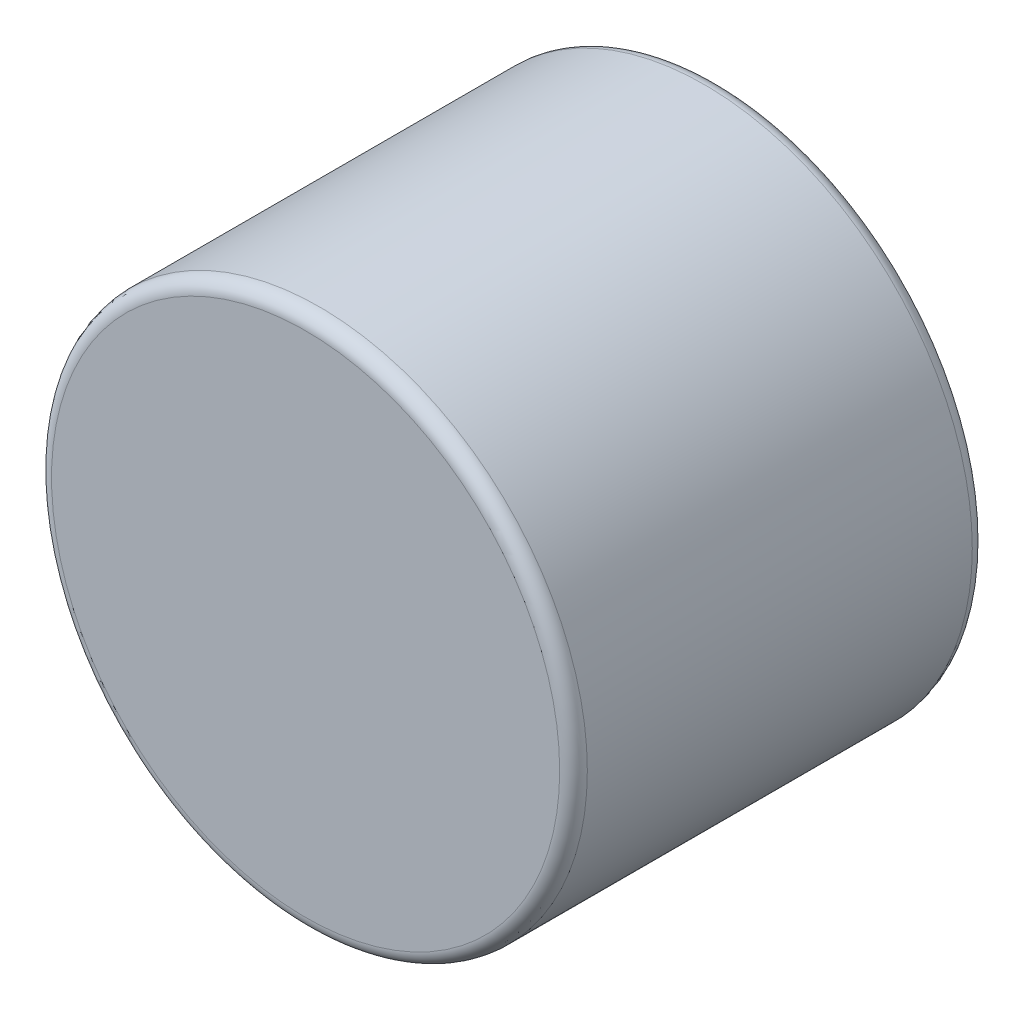
ISO-10303-21;
HEADER;
FILE_DESCRIPTION(('STEP AP214'),'2;1');
FILE_NAME('part.step','',(''),(''),'','','');
FILE_SCHEMA(('AUTOMOTIVE_DESIGN { 1 0 10303 214 1 1 1 1 }'));
ENDSEC;
DATA;
#1=APPLICATION_CONTEXT('core data for automotive mechanical design processes');
#2=APPLICATION_PROTOCOL_DEFINITION('international standard','automotive_design',2000,#1);
#3=PRODUCT_CONTEXT('',#1,'mechanical');
#4=PRODUCT('Part','Part','',(#3));
#5=PRODUCT_RELATED_PRODUCT_CATEGORY('part','',(#4));
#6=PRODUCT_DEFINITION_FORMATION('','',#4);
#7=PRODUCT_DEFINITION_CONTEXT('part definition',#1,'design');
#8=PRODUCT_DEFINITION('design','',#6,#7);
#9=PRODUCT_DEFINITION_SHAPE('','',#8);
#10=(LENGTH_UNIT() NAMED_UNIT(*) SI_UNIT(.MILLI.,.METRE.));
#11=(NAMED_UNIT(*) PLANE_ANGLE_UNIT() SI_UNIT($,.RADIAN.));
#12=(NAMED_UNIT(*) SI_UNIT($,.STERADIAN.) SOLID_ANGLE_UNIT());
#13=UNCERTAINTY_MEASURE_WITH_UNIT(LENGTH_MEASURE(1.E-05),#10,'distance_accuracy_value','');
#14=(GEOMETRIC_REPRESENTATION_CONTEXT(3) GLOBAL_UNCERTAINTY_ASSIGNED_CONTEXT((#13)) GLOBAL_UNIT_ASSIGNED_CONTEXT((#10,
#11,#12)) REPRESENTATION_CONTEXT('',''));
#15=CARTESIAN_POINT('',(0.,0.,0.));
#16=DIRECTION('',(0.,0.,1.));
#17=DIRECTION('',(1.,0.,0.));
#18=AXIS2_PLACEMENT_3D('',#15,#16,#17);
#19=CARTESIAN_POINT('',(0.,0.,75.7936));
#20=DIRECTION('',(0.,0.,-1.));
#21=DIRECTION('',(-1.,0.,0.));
#22=AXIS2_PLACEMENT_3D('',#19,#20,#21);
#23=CYLINDRICAL_SURFACE('',#22,49.2125);
#24=CARTESIAN_POINT('',(0.,0.,2.54));
#25=DIRECTION('',(0.,0.,1.));
#26=DIRECTION('',(1.,0.,0.));
#27=AXIS2_PLACEMENT_3D('',#24,#25,#26);
#28=CIRCLE('',#27,49.2125);
#29=CARTESIAN_POINT('',(49.2125,0.,2.54));
#30=VERTEX_POINT('',#29);
#31=EDGE_CURVE('E49',#30,#30,#28,.T.);
#32=ORIENTED_EDGE('',*,*,#31,.T.);
#33=EDGE_LOOP('',(#32));
#34=FACE_BOUND('',#33,.T.);
#35=CARTESIAN_POINT('',(0.,0.,73.2536));
#36=DIRECTION('',(0.,0.,1.));
#37=DIRECTION('',(1.,0.,0.));
#38=AXIS2_PLACEMENT_3D('',#35,#36,#37);
#39=CIRCLE('',#38,49.2125);
#40=CARTESIAN_POINT('',(49.2125,0.,73.2536));
#41=VERTEX_POINT('',#40);
#42=EDGE_CURVE('E53',#41,#41,#39,.F.);
#43=ORIENTED_EDGE('',*,*,#42,.T.);
#44=EDGE_LOOP('',(#43));
#45=FACE_BOUND('',#44,.T.);
#46=ADVANCED_FACE('F38',(#34,#45),#23,.T.);
#47=CARTESIAN_POINT('',(0.,0.,75.7936));
#48=DIRECTION('',(0.,0.,1.));
#49=DIRECTION('',(1.,0.,0.));
#50=AXIS2_PLACEMENT_3D('',#47,#48,#49);
#51=PLANE('',#50);
#52=CARTESIAN_POINT('',(0.,0.,75.7936));
#53=DIRECTION('',(0.,0.,1.));
#54=DIRECTION('',(1.,0.,0.));
#55=AXIS2_PLACEMENT_3D('',#52,#53,#54);
#56=CIRCLE('',#55,46.6725);
#57=CARTESIAN_POINT('',(46.6725,0.,75.7936));
#58=VERTEX_POINT('',#57);
#59=EDGE_CURVE('E10',#58,#58,#56,.T.);
#60=ORIENTED_EDGE('',*,*,#59,.T.);
#61=EDGE_LOOP('',(#60));
#62=FACE_BOUND('',#61,.T.);
#63=ADVANCED_FACE('F69',(#62),#51,.T.);
#64=CARTESIAN_POINT('',(0.,0.,0.));
#65=DIRECTION('',(0.,0.,1.));
#66=DIRECTION('',(1.,0.,0.));
#67=AXIS2_PLACEMENT_3D('',#64,#65,#66);
#68=PLANE('',#67);
#69=CARTESIAN_POINT('',(0.,0.,0.));
#70=DIRECTION('',(0.,0.,1.));
#71=DIRECTION('',(1.,0.,0.));
#72=AXIS2_PLACEMENT_3D('',#69,#70,#71);
#73=CIRCLE('',#72,46.6725);
#74=CARTESIAN_POINT('',(46.6725,0.,0.));
#75=VERTEX_POINT('',#74);
#76=EDGE_CURVE('E45',#75,#75,#73,.F.);
#77=ORIENTED_EDGE('',*,*,#76,.T.);
#78=EDGE_LOOP('',(#77));
#79=FACE_BOUND('',#78,.T.);
#80=ADVANCED_FACE('F66',(#79),#68,.F.);
#81=CARTESIAN_POINT('',(0.,0.,2.54));
#82=DIRECTION('',(0.,0.,1.));
#83=DIRECTION('',(1.,0.,0.));
#84=AXIS2_PLACEMENT_3D('',#81,#82,#83);
#85=TOROIDAL_SURFACE('',#84,46.6725,2.54);
#86=ORIENTED_EDGE('',*,*,#76,.F.);
#87=EDGE_LOOP('',(#86));
#88=FACE_BOUND('',#87,.T.);
#89=ORIENTED_EDGE('',*,*,#31,.F.);
#90=EDGE_LOOP('',(#89));
#91=FACE_BOUND('',#90,.T.);
#92=ADVANCED_FACE('F62',(#88,#91),#85,.T.);
#93=CARTESIAN_POINT('',(0.,0.,73.2536));
#94=DIRECTION('',(0.,0.,1.));
#95=DIRECTION('',(1.,0.,0.));
#96=AXIS2_PLACEMENT_3D('',#93,#94,#95);
#97=TOROIDAL_SURFACE('',#96,46.6725,2.54);
#98=ORIENTED_EDGE('',*,*,#42,.F.);
#99=EDGE_LOOP('',(#98));
#100=FACE_BOUND('',#99,.T.);
#101=ORIENTED_EDGE('',*,*,#59,.F.);
#102=EDGE_LOOP('',(#101));
#103=FACE_BOUND('',#102,.T.);
#104=ADVANCED_FACE('F40',(#100,#103),#97,.T.);
#105=CLOSED_SHELL('',(#46,#63,#80,#92,#104));
#106=MANIFOLD_SOLID_BREP('B2',#105);
#107=ADVANCED_BREP_SHAPE_REPRESENTATION('',(#18,#106),#14);
#108=SHAPE_DEFINITION_REPRESENTATION(#9,#107);
ENDSEC;
END-ISO-10303-21;
